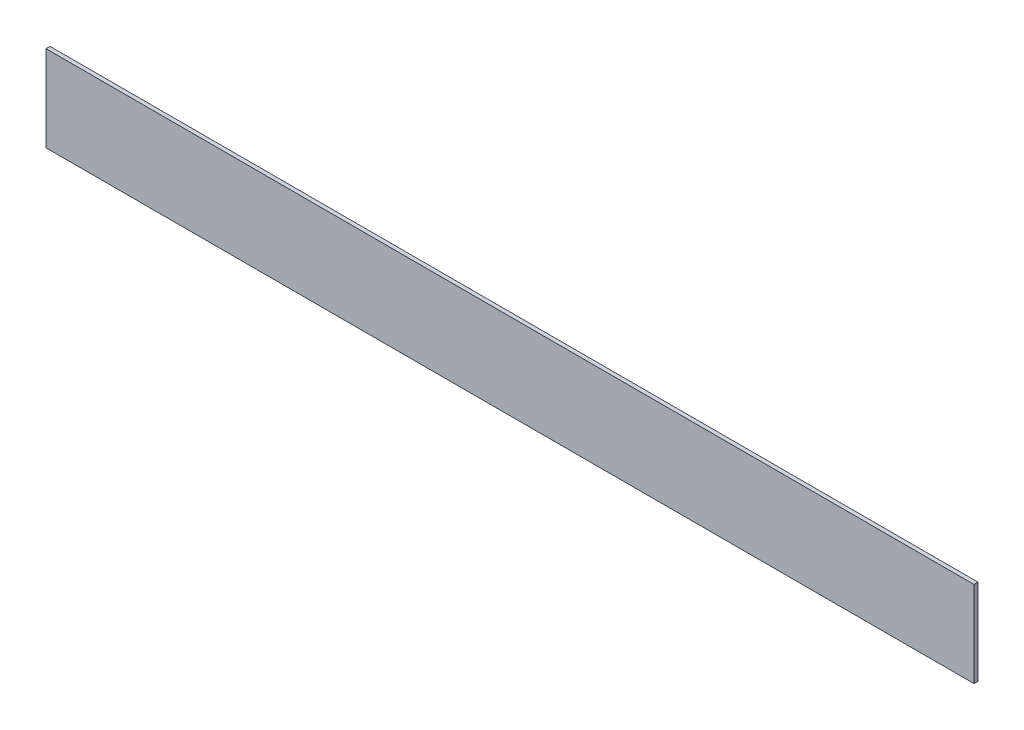
ISO-10303-21;
HEADER;
FILE_DESCRIPTION(('STEP AP214'),'2;1');
FILE_NAME('part.step','',(''),(''),'','','');
FILE_SCHEMA(('AUTOMOTIVE_DESIGN { 1 0 10303 214 1 1 1 1 }'));
ENDSEC;
DATA;
#1=APPLICATION_CONTEXT('core data for automotive mechanical design processes');
#2=APPLICATION_PROTOCOL_DEFINITION('international standard','automotive_design',2000,#1);
#3=PRODUCT_CONTEXT('',#1,'mechanical');
#4=PRODUCT('Part','Part','',(#3));
#5=PRODUCT_RELATED_PRODUCT_CATEGORY('part','',(#4));
#6=PRODUCT_DEFINITION_FORMATION('','',#4);
#7=PRODUCT_DEFINITION_CONTEXT('part definition',#1,'design');
#8=PRODUCT_DEFINITION('design','',#6,#7);
#9=PRODUCT_DEFINITION_SHAPE('','',#8);
#10=(LENGTH_UNIT() NAMED_UNIT(*) SI_UNIT(.MILLI.,.METRE.));
#11=(NAMED_UNIT(*) PLANE_ANGLE_UNIT() SI_UNIT($,.RADIAN.));
#12=(NAMED_UNIT(*) SI_UNIT($,.STERADIAN.) SOLID_ANGLE_UNIT());
#13=UNCERTAINTY_MEASURE_WITH_UNIT(LENGTH_MEASURE(1.E-05),#10,'distance_accuracy_value','');
#14=(GEOMETRIC_REPRESENTATION_CONTEXT(3) GLOBAL_UNCERTAINTY_ASSIGNED_CONTEXT((#13)) GLOBAL_UNIT_ASSIGNED_CONTEXT((#10,
#11,#12)) REPRESENTATION_CONTEXT('',''));
#15=CARTESIAN_POINT('',(0.,0.,0.));
#16=DIRECTION('',(0.,0.,1.));
#17=DIRECTION('',(1.,0.,0.));
#18=AXIS2_PLACEMENT_3D('',#15,#16,#17);
#19=CARTESIAN_POINT('',(-949.,-436.3,-6.));
#20=DIRECTION('',(-1.,0.,0.));
#21=DIRECTION('',(0.,0.,1.));
#22=AXIS2_PLACEMENT_3D('',#19,#20,#21);
#23=PLANE('',#22);
#24=DIRECTION('',(0.,-1.,0.));
#25=VECTOR('',#24,1.);
#26=CARTESIAN_POINT('',(-949.,-436.3,0.));
#27=LINE('',#26,#25);
#28=CARTESIAN_POINT('',(-949.,-307.08,0.));
#29=VERTEX_POINT('',#28);
#30=CARTESIAN_POINT('',(-949.,-436.3,0.));
#31=VERTEX_POINT('',#30);
#32=EDGE_CURVE('E103',#29,#31,#27,.T.);
#33=ORIENTED_EDGE('',*,*,#32,.F.);
#34=DIRECTION('',(0.,0.,1.));
#35=VECTOR('',#34,1.);
#36=CARTESIAN_POINT('',(-949.,-307.08,-6.));
#37=LINE('',#36,#35);
#38=CARTESIAN_POINT('',(-949.,-307.08,-6.));
#39=VERTEX_POINT('',#38);
#40=EDGE_CURVE('E11',#39,#29,#37,.T.);
#41=ORIENTED_EDGE('',*,*,#40,.F.);
#42=DIRECTION('',(0.,-1.,0.));
#43=VECTOR('',#42,1.);
#44=CARTESIAN_POINT('',(-949.,-436.3,-6.));
#45=LINE('',#44,#43);
#46=CARTESIAN_POINT('',(-949.,-436.3,-6.));
#47=VERTEX_POINT('',#46);
#48=EDGE_CURVE('E97',#39,#47,#45,.T.);
#49=ORIENTED_EDGE('',*,*,#48,.T.);
#50=DIRECTION('',(0.,0.,1.));
#51=VECTOR('',#50,1.);
#52=CARTESIAN_POINT('',(-949.,-436.3,-6.));
#53=LINE('',#52,#51);
#54=EDGE_CURVE('E42',#47,#31,#53,.T.);
#55=ORIENTED_EDGE('',*,*,#54,.T.);
#56=EDGE_LOOP('',(#33,#41,#49,#55));
#57=FACE_BOUND('',#56,.T.);
#58=ADVANCED_FACE('F39',(#57),#23,.T.);
#59=CARTESIAN_POINT('',(-949.,-307.08,-6.));
#60=DIRECTION('',(0.,1.,0.));
#61=DIRECTION('',(0.,0.,1.));
#62=AXIS2_PLACEMENT_3D('',#59,#60,#61);
#63=PLANE('',#62);
#64=DIRECTION('',(-1.,0.,0.));
#65=VECTOR('',#64,1.);
#66=CARTESIAN_POINT('',(-949.,-307.08,0.));
#67=LINE('',#66,#65);
#68=CARTESIAN_POINT('',(447.,-307.08,0.));
#69=VERTEX_POINT('',#68);
#70=EDGE_CURVE('E99',#69,#29,#67,.T.);
#71=ORIENTED_EDGE('',*,*,#70,.F.);
#72=DIRECTION('',(0.,0.,1.));
#73=VECTOR('',#72,1.);
#74=CARTESIAN_POINT('',(447.,-307.08,-6.));
#75=LINE('',#74,#73);
#76=CARTESIAN_POINT('',(447.,-307.08,-6.));
#77=VERTEX_POINT('',#76);
#78=EDGE_CURVE('E48',#77,#69,#75,.T.);
#79=ORIENTED_EDGE('',*,*,#78,.F.);
#80=DIRECTION('',(-1.,0.,0.));
#81=VECTOR('',#80,1.);
#82=CARTESIAN_POINT('',(-949.,-307.08,-6.));
#83=LINE('',#82,#81);
#84=EDGE_CURVE('E94',#77,#39,#83,.T.);
#85=ORIENTED_EDGE('',*,*,#84,.T.);
#86=ORIENTED_EDGE('',*,*,#40,.T.);
#87=EDGE_LOOP('',(#71,#79,#85,#86));
#88=FACE_BOUND('',#87,.T.);
#89=ADVANCED_FACE('F113',(#88),#63,.T.);
#90=CARTESIAN_POINT('',(447.,-436.3,-6.));
#91=DIRECTION('',(1.,0.,0.));
#92=DIRECTION('',(0.,1.,0.));
#93=AXIS2_PLACEMENT_3D('',#90,#91,#92);
#94=PLANE('',#93);
#95=DIRECTION('',(0.,1.,0.));
#96=VECTOR('',#95,1.);
#97=CARTESIAN_POINT('',(447.,-436.3,0.));
#98=LINE('',#97,#96);
#99=CARTESIAN_POINT('',(447.,-436.3,0.));
#100=VERTEX_POINT('',#99);
#101=EDGE_CURVE('E89',#100,#69,#98,.T.);
#102=ORIENTED_EDGE('',*,*,#101,.F.);
#103=DIRECTION('',(0.,0.,1.));
#104=VECTOR('',#103,1.);
#105=CARTESIAN_POINT('',(447.,-436.3,-6.));
#106=LINE('',#105,#104);
#107=CARTESIAN_POINT('',(447.,-436.3,-6.));
#108=VERTEX_POINT('',#107);
#109=EDGE_CURVE('E84',#108,#100,#106,.T.);
#110=ORIENTED_EDGE('',*,*,#109,.F.);
#111=DIRECTION('',(0.,1.,0.));
#112=VECTOR('',#111,1.);
#113=CARTESIAN_POINT('',(447.,-436.3,-6.));
#114=LINE('',#113,#112);
#115=EDGE_CURVE('E87',#108,#77,#114,.T.);
#116=ORIENTED_EDGE('',*,*,#115,.T.);
#117=ORIENTED_EDGE('',*,*,#78,.T.);
#118=EDGE_LOOP('',(#102,#110,#116,#117));
#119=FACE_BOUND('',#118,.T.);
#120=ADVANCED_FACE('F86',(#119),#94,.T.);
#121=CARTESIAN_POINT('',(-949.,-436.3,-6.));
#122=DIRECTION('',(0.,-1.,0.));
#123=DIRECTION('',(0.,0.,-1.));
#124=AXIS2_PLACEMENT_3D('',#121,#122,#123);
#125=PLANE('',#124);
#126=DIRECTION('',(1.,0.,0.));
#127=VECTOR('',#126,1.);
#128=CARTESIAN_POINT('',(-949.,-436.3,0.));
#129=LINE('',#128,#127);
#130=EDGE_CURVE('E106',#31,#100,#129,.T.);
#131=ORIENTED_EDGE('',*,*,#130,.F.);
#132=ORIENTED_EDGE('',*,*,#54,.F.);
#133=DIRECTION('',(1.,0.,0.));
#134=VECTOR('',#133,1.);
#135=CARTESIAN_POINT('',(-949.,-436.3,-6.));
#136=LINE('',#135,#134);
#137=EDGE_CURVE('E93',#47,#108,#136,.T.);
#138=ORIENTED_EDGE('',*,*,#137,.T.);
#139=ORIENTED_EDGE('',*,*,#109,.T.);
#140=EDGE_LOOP('',(#131,#132,#138,#139));
#141=FACE_BOUND('',#140,.T.);
#142=ADVANCED_FACE('F96',(#141),#125,.T.);
#143=CARTESIAN_POINT('',(0.,0.,-6.));
#144=DIRECTION('',(0.,0.,-1.));
#145=DIRECTION('',(-1.,0.,0.));
#146=AXIS2_PLACEMENT_3D('',#143,#144,#145);
#147=PLANE('',#146);
#148=ORIENTED_EDGE('',*,*,#48,.F.);
#149=ORIENTED_EDGE('',*,*,#84,.F.);
#150=ORIENTED_EDGE('',*,*,#115,.F.);
#151=ORIENTED_EDGE('',*,*,#137,.F.);
#152=EDGE_LOOP('',(#148,#149,#150,#151));
#153=FACE_BOUND('',#152,.T.);
#154=ADVANCED_FACE('F92',(#153),#147,.T.);
#155=CARTESIAN_POINT('',(0.,0.,0.));
#156=DIRECTION('',(0.,0.,-1.));
#157=DIRECTION('',(-1.,0.,0.));
#158=AXIS2_PLACEMENT_3D('',#155,#156,#157);
#159=PLANE('',#158);
#160=ORIENTED_EDGE('',*,*,#32,.T.);
#161=ORIENTED_EDGE('',*,*,#130,.T.);
#162=ORIENTED_EDGE('',*,*,#101,.T.);
#163=ORIENTED_EDGE('',*,*,#70,.T.);
#164=EDGE_LOOP('',(#160,#161,#162,#163));
#165=FACE_BOUND('',#164,.T.);
#166=ADVANCED_FACE('F112',(#165),#159,.F.);
#167=CLOSED_SHELL('',(#58,#89,#120,#142,#154,#166));
#168=MANIFOLD_SOLID_BREP('B2',#167);
#169=ADVANCED_BREP_SHAPE_REPRESENTATION('',(#18,#168),#14);
#170=SHAPE_DEFINITION_REPRESENTATION(#9,#169);
ENDSEC;
END-ISO-10303-21;
